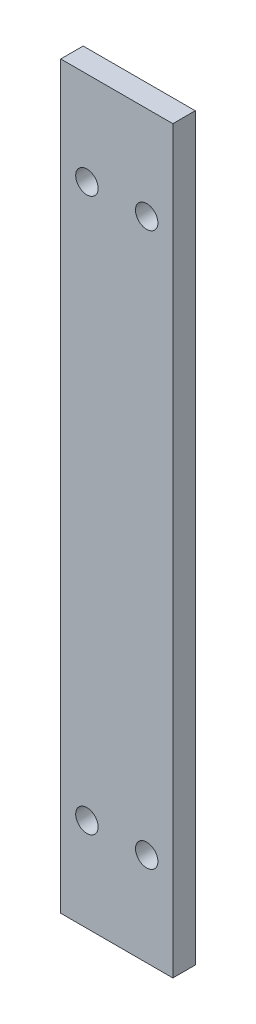
ISO-10303-21;
HEADER;
FILE_DESCRIPTION(('STEP AP214'),'2;1');
FILE_NAME('part.step','',(''),(''),'','','');
FILE_SCHEMA(('AUTOMOTIVE_DESIGN { 1 0 10303 214 1 1 1 1 }'));
ENDSEC;
DATA;
#1=APPLICATION_CONTEXT('core data for automotive mechanical design processes');
#2=APPLICATION_PROTOCOL_DEFINITION('international standard','automotive_design',2000,#1);
#3=PRODUCT_CONTEXT('',#1,'mechanical');
#4=PRODUCT('Part','Part','',(#3));
#5=PRODUCT_RELATED_PRODUCT_CATEGORY('part','',(#4));
#6=PRODUCT_DEFINITION_FORMATION('','',#4);
#7=PRODUCT_DEFINITION_CONTEXT('part definition',#1,'design');
#8=PRODUCT_DEFINITION('design','',#6,#7);
#9=PRODUCT_DEFINITION_SHAPE('','',#8);
#10=(LENGTH_UNIT() NAMED_UNIT(*) SI_UNIT(.MILLI.,.METRE.));
#11=(NAMED_UNIT(*) PLANE_ANGLE_UNIT() SI_UNIT($,.RADIAN.));
#12=(NAMED_UNIT(*) SI_UNIT($,.STERADIAN.) SOLID_ANGLE_UNIT());
#13=UNCERTAINTY_MEASURE_WITH_UNIT(LENGTH_MEASURE(1.E-05),#10,'distance_accuracy_value','');
#14=(GEOMETRIC_REPRESENTATION_CONTEXT(3) GLOBAL_UNCERTAINTY_ASSIGNED_CONTEXT((#13)) GLOBAL_UNIT_ASSIGNED_CONTEXT((#10,
#11,#12)) REPRESENTATION_CONTEXT('',''));
#15=CARTESIAN_POINT('',(0.,0.,0.));
#16=DIRECTION('',(0.,0.,1.));
#17=DIRECTION('',(1.,0.,0.));
#18=AXIS2_PLACEMENT_3D('',#15,#16,#17);
#19=CARTESIAN_POINT('',(0.,0.,3.));
#20=DIRECTION('',(0.,0.,1.));
#21=DIRECTION('',(1.,0.,0.));
#22=AXIS2_PLACEMENT_3D('',#19,#20,#21);
#23=PLANE('',#22);
#24=CARTESIAN_POINT('',(4.,-37.,3.));
#25=DIRECTION('',(0.,0.,1.));
#26=DIRECTION('',(1.,0.,0.));
#27=AXIS2_PLACEMENT_3D('',#24,#25,#26);
#28=CIRCLE('',#27,1.5);
#29=CARTESIAN_POINT('',(5.5,-37.,3.));
#30=VERTEX_POINT('',#29);
#31=EDGE_CURVE('E142',#30,#30,#28,.T.);
#32=ORIENTED_EDGE('',*,*,#31,.F.);
#33=EDGE_LOOP('',(#32));
#34=FACE_BOUND('',#33,.T.);
#35=CARTESIAN_POINT('',(-4.,37.,3.));
#36=DIRECTION('',(0.,0.,1.));
#37=DIRECTION('',(1.,0.,0.));
#38=AXIS2_PLACEMENT_3D('',#35,#36,#37);
#39=CIRCLE('',#38,1.5);
#40=CARTESIAN_POINT('',(-2.5,37.,3.));
#41=VERTEX_POINT('',#40);
#42=EDGE_CURVE('E112',#41,#41,#39,.T.);
#43=ORIENTED_EDGE('',*,*,#42,.F.);
#44=EDGE_LOOP('',(#43));
#45=FACE_BOUND('',#44,.T.);
#46=DIRECTION('',(0.,1.,0.));
#47=VECTOR('',#46,1.);
#48=CARTESIAN_POINT('',(7.5,49.5,3.));
#49=LINE('',#48,#47);
#50=CARTESIAN_POINT('',(7.5,-49.5,3.));
#51=VERTEX_POINT('',#50);
#52=CARTESIAN_POINT('',(7.5,49.5,3.));
#53=VERTEX_POINT('',#52);
#54=EDGE_CURVE('E92',#51,#53,#49,.T.);
#55=ORIENTED_EDGE('',*,*,#54,.T.);
#56=DIRECTION('',(-1.,0.,0.));
#57=VECTOR('',#56,1.);
#58=CARTESIAN_POINT('',(-7.5,49.5,3.));
#59=LINE('',#58,#57);
#60=CARTESIAN_POINT('',(-7.5,49.5,3.));
#61=VERTEX_POINT('',#60);
#62=EDGE_CURVE('E87',#53,#61,#59,.T.);
#63=ORIENTED_EDGE('',*,*,#62,.T.);
#64=DIRECTION('',(0.,-1.,0.));
#65=VECTOR('',#64,1.);
#66=CARTESIAN_POINT('',(-7.5,49.5,3.));
#67=LINE('',#66,#65);
#68=CARTESIAN_POINT('',(-7.5,-49.5,3.));
#69=VERTEX_POINT('',#68);
#70=EDGE_CURVE('E90',#61,#69,#67,.T.);
#71=ORIENTED_EDGE('',*,*,#70,.T.);
#72=DIRECTION('',(1.,0.,0.));
#73=VECTOR('',#72,1.);
#74=CARTESIAN_POINT('',(-7.5,-49.5,3.));
#75=LINE('',#74,#73);
#76=EDGE_CURVE('E57',#69,#51,#75,.T.);
#77=ORIENTED_EDGE('',*,*,#76,.T.);
#78=EDGE_LOOP('',(#55,#63,#71,#77));
#79=FACE_BOUND('',#78,.T.);
#80=CARTESIAN_POINT('',(4.,37.,3.));
#81=DIRECTION('',(0.,0.,1.));
#82=DIRECTION('',(-1.,0.,0.));
#83=AXIS2_PLACEMENT_3D('',#80,#81,#82);
#84=CIRCLE('',#83,1.5);
#85=CARTESIAN_POINT('',(2.5,37.,3.));
#86=VERTEX_POINT('',#85);
#87=EDGE_CURVE('E134',#86,#86,#84,.T.);
#88=ORIENTED_EDGE('',*,*,#87,.F.);
#89=EDGE_LOOP('',(#88));
#90=FACE_BOUND('',#89,.T.);
#91=CARTESIAN_POINT('',(-4.,-37.,3.));
#92=DIRECTION('',(0.,0.,1.));
#93=DIRECTION('',(-1.,0.,0.));
#94=AXIS2_PLACEMENT_3D('',#91,#92,#93);
#95=CIRCLE('',#94,1.5);
#96=CARTESIAN_POINT('',(-5.5,-37.,3.));
#97=VERTEX_POINT('',#96);
#98=EDGE_CURVE('E150',#97,#97,#95,.T.);
#99=ORIENTED_EDGE('',*,*,#98,.F.);
#100=EDGE_LOOP('',(#99));
#101=FACE_BOUND('',#100,.T.);
#102=ADVANCED_FACE('F39',(#34,#45,#79,#90,#101),#23,.T.);
#103=CARTESIAN_POINT('',(0.,0.,0.));
#104=DIRECTION('',(0.,0.,1.));
#105=DIRECTION('',(1.,0.,0.));
#106=AXIS2_PLACEMENT_3D('',#103,#104,#105);
#107=PLANE('',#106);
#108=DIRECTION('',(0.,1.,0.));
#109=VECTOR('',#108,1.);
#110=CARTESIAN_POINT('',(7.5,49.5,0.));
#111=LINE('',#110,#109);
#112=CARTESIAN_POINT('',(7.5,-49.5,0.));
#113=VERTEX_POINT('',#112);
#114=CARTESIAN_POINT('',(7.5,49.5,0.));
#115=VERTEX_POINT('',#114);
#116=EDGE_CURVE('E108',#113,#115,#111,.T.);
#117=ORIENTED_EDGE('',*,*,#116,.F.);
#118=DIRECTION('',(1.,0.,0.));
#119=VECTOR('',#118,1.);
#120=CARTESIAN_POINT('',(-7.5,-49.5,0.));
#121=LINE('',#120,#119);
#122=CARTESIAN_POINT('',(-7.5,-49.5,0.));
#123=VERTEX_POINT('',#122);
#124=EDGE_CURVE('E80',#123,#113,#121,.T.);
#125=ORIENTED_EDGE('',*,*,#124,.F.);
#126=DIRECTION('',(0.,-1.,0.));
#127=VECTOR('',#126,1.);
#128=CARTESIAN_POINT('',(-7.5,49.5,0.));
#129=LINE('',#128,#127);
#130=CARTESIAN_POINT('',(-7.5,49.5,0.));
#131=VERTEX_POINT('',#130);
#132=EDGE_CURVE('E74',#131,#123,#129,.T.);
#133=ORIENTED_EDGE('',*,*,#132,.F.);
#134=DIRECTION('',(-1.,0.,0.));
#135=VECTOR('',#134,1.);
#136=CARTESIAN_POINT('',(-7.5,49.5,0.));
#137=LINE('',#136,#135);
#138=EDGE_CURVE('E97',#115,#131,#137,.T.);
#139=ORIENTED_EDGE('',*,*,#138,.F.);
#140=EDGE_LOOP('',(#117,#125,#133,#139));
#141=FACE_BOUND('',#140,.T.);
#142=CARTESIAN_POINT('',(-4.,37.,0.));
#143=DIRECTION('',(0.,0.,1.));
#144=DIRECTION('',(1.,0.,0.));
#145=AXIS2_PLACEMENT_3D('',#142,#143,#144);
#146=CIRCLE('',#145,1.5);
#147=CARTESIAN_POINT('',(-2.5,37.,0.));
#148=VERTEX_POINT('',#147);
#149=EDGE_CURVE('E130',#148,#148,#146,.T.);
#150=ORIENTED_EDGE('',*,*,#149,.T.);
#151=EDGE_LOOP('',(#150));
#152=FACE_BOUND('',#151,.T.);
#153=CARTESIAN_POINT('',(4.,37.,0.));
#154=DIRECTION('',(0.,0.,1.));
#155=DIRECTION('',(-1.,0.,0.));
#156=AXIS2_PLACEMENT_3D('',#153,#154,#155);
#157=CIRCLE('',#156,1.5);
#158=CARTESIAN_POINT('',(2.5,37.,0.));
#159=VERTEX_POINT('',#158);
#160=EDGE_CURVE('E138',#159,#159,#157,.T.);
#161=ORIENTED_EDGE('',*,*,#160,.T.);
#162=EDGE_LOOP('',(#161));
#163=FACE_BOUND('',#162,.T.);
#164=CARTESIAN_POINT('',(4.,-37.,0.));
#165=DIRECTION('',(0.,0.,1.));
#166=DIRECTION('',(1.,0.,0.));
#167=AXIS2_PLACEMENT_3D('',#164,#165,#166);
#168=CIRCLE('',#167,1.5);
#169=CARTESIAN_POINT('',(5.5,-37.,0.));
#170=VERTEX_POINT('',#169);
#171=EDGE_CURVE('E146',#170,#170,#168,.T.);
#172=ORIENTED_EDGE('',*,*,#171,.T.);
#173=EDGE_LOOP('',(#172));
#174=FACE_BOUND('',#173,.T.);
#175=CARTESIAN_POINT('',(-4.,-37.,0.));
#176=DIRECTION('',(0.,0.,1.));
#177=DIRECTION('',(-1.,0.,0.));
#178=AXIS2_PLACEMENT_3D('',#175,#176,#177);
#179=CIRCLE('',#178,1.5);
#180=CARTESIAN_POINT('',(-5.5,-37.,0.));
#181=VERTEX_POINT('',#180);
#182=EDGE_CURVE('E154',#181,#181,#179,.T.);
#183=ORIENTED_EDGE('',*,*,#182,.T.);
#184=EDGE_LOOP('',(#183));
#185=FACE_BOUND('',#184,.T.);
#186=ADVANCED_FACE('F125',(#141,#152,#163,#174,#185),#107,.F.);
#187=CARTESIAN_POINT('',(7.5,49.5,3.));
#188=DIRECTION('',(-1.,0.,0.));
#189=DIRECTION('',(0.,0.,1.));
#190=AXIS2_PLACEMENT_3D('',#187,#188,#189);
#191=PLANE('',#190);
#192=ORIENTED_EDGE('',*,*,#116,.T.);
#193=DIRECTION('',(0.,0.,-1.));
#194=VECTOR('',#193,1.);
#195=CARTESIAN_POINT('',(7.5,49.5,3.));
#196=LINE('',#195,#194);
#197=EDGE_CURVE('E11',#53,#115,#196,.T.);
#198=ORIENTED_EDGE('',*,*,#197,.F.);
#199=ORIENTED_EDGE('',*,*,#54,.F.);
#200=DIRECTION('',(0.,0.,-1.));
#201=VECTOR('',#200,1.);
#202=CARTESIAN_POINT('',(7.5,-49.5,3.));
#203=LINE('',#202,#201);
#204=EDGE_CURVE('E104',#51,#113,#203,.T.);
#205=ORIENTED_EDGE('',*,*,#204,.T.);
#206=EDGE_LOOP('',(#192,#198,#199,#205));
#207=FACE_BOUND('',#206,.T.);
#208=ADVANCED_FACE('F41',(#207),#191,.F.);
#209=CARTESIAN_POINT('',(-7.5,49.5,3.));
#210=DIRECTION('',(0.,-1.,0.));
#211=DIRECTION('',(0.,0.,-1.));
#212=AXIS2_PLACEMENT_3D('',#209,#210,#211);
#213=PLANE('',#212);
#214=ORIENTED_EDGE('',*,*,#138,.T.);
#215=DIRECTION('',(0.,0.,-1.));
#216=VECTOR('',#215,1.);
#217=CARTESIAN_POINT('',(-7.5,49.5,3.));
#218=LINE('',#217,#216);
#219=EDGE_CURVE('E49',#61,#131,#218,.T.);
#220=ORIENTED_EDGE('',*,*,#219,.F.);
#221=ORIENTED_EDGE('',*,*,#62,.F.);
#222=ORIENTED_EDGE('',*,*,#197,.T.);
#223=EDGE_LOOP('',(#214,#220,#221,#222));
#224=FACE_BOUND('',#223,.T.);
#225=ADVANCED_FACE('F96',(#224),#213,.F.);
#226=CARTESIAN_POINT('',(-7.5,49.5,3.));
#227=DIRECTION('',(1.,0.,0.));
#228=DIRECTION('',(0.,0.,-1.));
#229=AXIS2_PLACEMENT_3D('',#226,#227,#228);
#230=PLANE('',#229);
#231=ORIENTED_EDGE('',*,*,#132,.T.);
#232=DIRECTION('',(0.,0.,-1.));
#233=VECTOR('',#232,1.);
#234=CARTESIAN_POINT('',(-7.5,-49.5,3.));
#235=LINE('',#234,#233);
#236=EDGE_CURVE('E99',#69,#123,#235,.T.);
#237=ORIENTED_EDGE('',*,*,#236,.F.);
#238=ORIENTED_EDGE('',*,*,#70,.F.);
#239=ORIENTED_EDGE('',*,*,#219,.T.);
#240=EDGE_LOOP('',(#231,#237,#238,#239));
#241=FACE_BOUND('',#240,.T.);
#242=ADVANCED_FACE('F100',(#241),#230,.F.);
#243=CARTESIAN_POINT('',(-7.5,-49.5,3.));
#244=DIRECTION('',(0.,1.,0.));
#245=DIRECTION('',(0.,0.,1.));
#246=AXIS2_PLACEMENT_3D('',#243,#244,#245);
#247=PLANE('',#246);
#248=ORIENTED_EDGE('',*,*,#124,.T.);
#249=ORIENTED_EDGE('',*,*,#204,.F.);
#250=ORIENTED_EDGE('',*,*,#76,.F.);
#251=ORIENTED_EDGE('',*,*,#236,.T.);
#252=EDGE_LOOP('',(#248,#249,#250,#251));
#253=FACE_BOUND('',#252,.T.);
#254=ADVANCED_FACE('F122',(#253),#247,.F.);
#255=CARTESIAN_POINT('',(-4.,37.,3.));
#256=DIRECTION('',(0.,0.,-1.));
#257=DIRECTION('',(-1.,0.,0.));
#258=AXIS2_PLACEMENT_3D('',#255,#256,#257);
#259=CYLINDRICAL_SURFACE('',#258,1.5);
#260=ORIENTED_EDGE('',*,*,#42,.T.);
#261=EDGE_LOOP('',(#260));
#262=FACE_BOUND('',#261,.T.);
#263=ORIENTED_EDGE('',*,*,#149,.F.);
#264=EDGE_LOOP('',(#263));
#265=FACE_BOUND('',#264,.T.);
#266=ADVANCED_FACE('F175',(#262,#265),#259,.F.);
#267=CARTESIAN_POINT('',(4.,37.,3.));
#268=DIRECTION('',(0.,0.,-1.));
#269=DIRECTION('',(-1.,0.,0.));
#270=AXIS2_PLACEMENT_3D('',#267,#268,#269);
#271=CYLINDRICAL_SURFACE('',#270,1.5);
#272=ORIENTED_EDGE('',*,*,#87,.T.);
#273=EDGE_LOOP('',(#272));
#274=FACE_BOUND('',#273,.T.);
#275=ORIENTED_EDGE('',*,*,#160,.F.);
#276=EDGE_LOOP('',(#275));
#277=FACE_BOUND('',#276,.T.);
#278=ADVANCED_FACE('F221',(#274,#277),#271,.F.);
#279=CARTESIAN_POINT('',(4.,-37.,3.));
#280=DIRECTION('',(0.,0.,-1.));
#281=DIRECTION('',(-1.,0.,0.));
#282=AXIS2_PLACEMENT_3D('',#279,#280,#281);
#283=CYLINDRICAL_SURFACE('',#282,1.5);
#284=ORIENTED_EDGE('',*,*,#31,.T.);
#285=EDGE_LOOP('',(#284));
#286=FACE_BOUND('',#285,.T.);
#287=ORIENTED_EDGE('',*,*,#171,.F.);
#288=EDGE_LOOP('',(#287));
#289=FACE_BOUND('',#288,.T.);
#290=ADVANCED_FACE('F229',(#286,#289),#283,.F.);
#291=CARTESIAN_POINT('',(-4.,-37.,3.));
#292=DIRECTION('',(0.,0.,-1.));
#293=DIRECTION('',(-1.,0.,0.));
#294=AXIS2_PLACEMENT_3D('',#291,#292,#293);
#295=CYLINDRICAL_SURFACE('',#294,1.5);
#296=ORIENTED_EDGE('',*,*,#98,.T.);
#297=EDGE_LOOP('',(#296));
#298=FACE_BOUND('',#297,.T.);
#299=ORIENTED_EDGE('',*,*,#182,.F.);
#300=EDGE_LOOP('',(#299));
#301=FACE_BOUND('',#300,.T.);
#302=ADVANCED_FACE('F162',(#298,#301),#295,.F.);
#303=CLOSED_SHELL('',(#102,#186,#208,#225,#242,#254,#266,#278,#290,#302));
#304=MANIFOLD_SOLID_BREP('B2',#303);
#305=ADVANCED_BREP_SHAPE_REPRESENTATION('',(#18,#304),#14);
#306=SHAPE_DEFINITION_REPRESENTATION(#9,#305);
ENDSEC;
END-ISO-10303-21;
